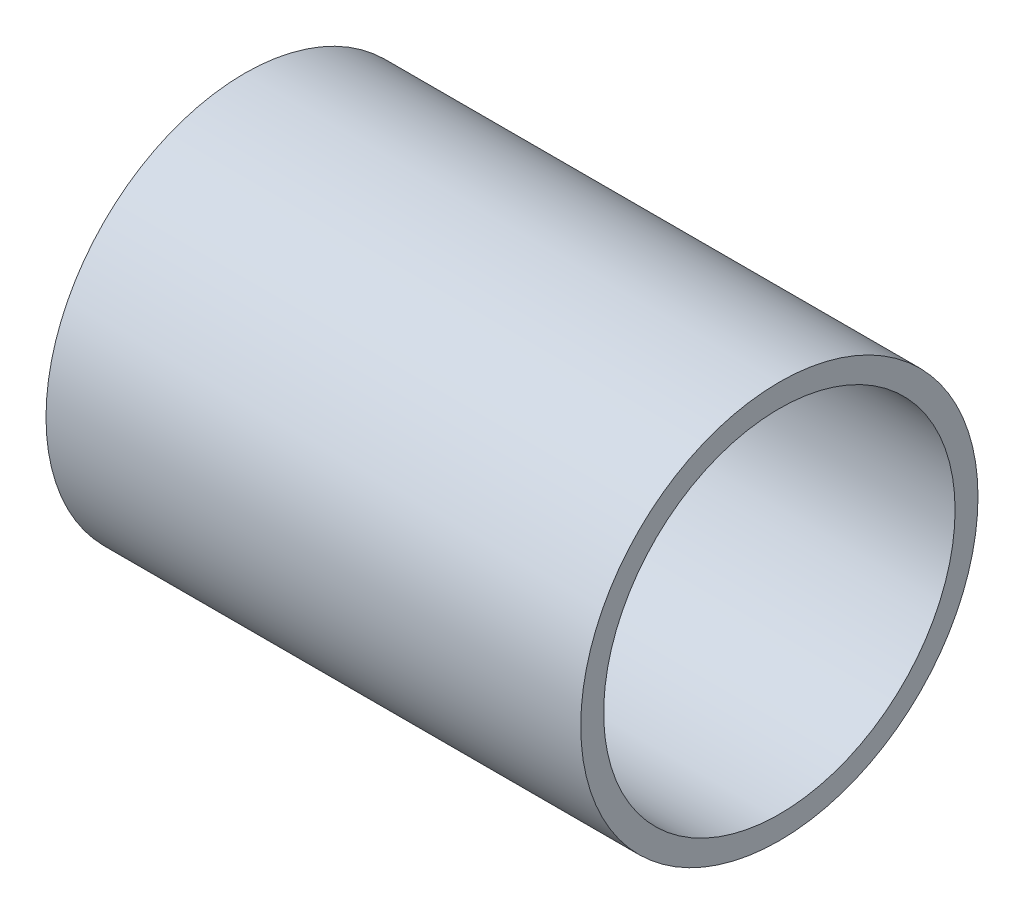
ISO-10303-21;
HEADER;
FILE_DESCRIPTION(('STEP AP214'),'2;1');
FILE_NAME('part.step','',(''),(''),'','','');
FILE_SCHEMA(('AUTOMOTIVE_DESIGN { 1 0 10303 214 1 1 1 1 }'));
ENDSEC;
DATA;
#1=APPLICATION_CONTEXT('core data for automotive mechanical design processes');
#2=APPLICATION_PROTOCOL_DEFINITION('international standard','automotive_design',2000,#1);
#3=PRODUCT_CONTEXT('',#1,'mechanical');
#4=PRODUCT('Part','Part','',(#3));
#5=PRODUCT_RELATED_PRODUCT_CATEGORY('part','',(#4));
#6=PRODUCT_DEFINITION_FORMATION('','',#4);
#7=PRODUCT_DEFINITION_CONTEXT('part definition',#1,'design');
#8=PRODUCT_DEFINITION('design','',#6,#7);
#9=PRODUCT_DEFINITION_SHAPE('','',#8);
#10=(LENGTH_UNIT() NAMED_UNIT(*) SI_UNIT(.MILLI.,.METRE.));
#11=(NAMED_UNIT(*) PLANE_ANGLE_UNIT() SI_UNIT($,.RADIAN.));
#12=(NAMED_UNIT(*) SI_UNIT($,.STERADIAN.) SOLID_ANGLE_UNIT());
#13=UNCERTAINTY_MEASURE_WITH_UNIT(LENGTH_MEASURE(1.E-05),#10,'distance_accuracy_value','');
#14=(GEOMETRIC_REPRESENTATION_CONTEXT(3) GLOBAL_UNCERTAINTY_ASSIGNED_CONTEXT((#13)) GLOBAL_UNIT_ASSIGNED_CONTEXT((#10,
#11,#12)) REPRESENTATION_CONTEXT('',''));
#15=CARTESIAN_POINT('',(0.,0.,0.));
#16=DIRECTION('',(0.,0.,1.));
#17=DIRECTION('',(1.,0.,0.));
#18=AXIS2_PLACEMENT_3D('',#15,#16,#17);
#19=CARTESIAN_POINT('',(-70.,0.,0.));
#20=DIRECTION('',(1.,0.,0.));
#21=DIRECTION('',(0.,0.,-1.));
#22=AXIS2_PLACEMENT_3D('',#19,#20,#21);
#23=CYLINDRICAL_SURFACE('',#22,26.);
#24=CARTESIAN_POINT('',(-70.,0.,0.));
#25=DIRECTION('',(1.,0.,0.));
#26=DIRECTION('',(0.,0.,-1.));
#27=AXIS2_PLACEMENT_3D('',#24,#25,#26);
#28=CIRCLE('',#27,26.);
#29=CARTESIAN_POINT('',(-70.,0.,-26.));
#30=VERTEX_POINT('',#29);
#31=EDGE_CURVE('E10',#30,#30,#28,.T.);
#32=ORIENTED_EDGE('',*,*,#31,.T.);
#33=EDGE_LOOP('',(#32));
#34=FACE_BOUND('',#33,.T.);
#35=CARTESIAN_POINT('',(0.,0.,0.));
#36=DIRECTION('',(1.,0.,0.));
#37=DIRECTION('',(0.,0.,-1.));
#38=AXIS2_PLACEMENT_3D('',#35,#36,#37);
#39=CIRCLE('',#38,26.);
#40=CARTESIAN_POINT('',(0.,0.,-26.));
#41=VERTEX_POINT('',#40);
#42=EDGE_CURVE('E40',#41,#41,#39,.T.);
#43=ORIENTED_EDGE('',*,*,#42,.F.);
#44=EDGE_LOOP('',(#43));
#45=FACE_BOUND('',#44,.T.);
#46=ADVANCED_FACE('F37',(#34,#45),#23,.T.);
#47=CARTESIAN_POINT('',(-70.,0.,0.));
#48=DIRECTION('',(1.,0.,0.));
#49=DIRECTION('',(0.,0.,-1.));
#50=AXIS2_PLACEMENT_3D('',#47,#48,#49);
#51=PLANE('',#50);
#52=CARTESIAN_POINT('',(-70.,0.,0.));
#53=DIRECTION('',(1.,0.,0.));
#54=DIRECTION('',(0.,0.,-1.));
#55=AXIS2_PLACEMENT_3D('',#52,#53,#54);
#56=CIRCLE('',#55,23.);
#57=CARTESIAN_POINT('',(-70.,0.,-23.));
#58=VERTEX_POINT('',#57);
#59=EDGE_CURVE('E49',#58,#58,#56,.T.);
#60=ORIENTED_EDGE('',*,*,#59,.T.);
#61=EDGE_LOOP('',(#60));
#62=FACE_BOUND('',#61,.T.);
#63=ORIENTED_EDGE('',*,*,#31,.F.);
#64=EDGE_LOOP('',(#63));
#65=FACE_BOUND('',#64,.T.);
#66=ADVANCED_FACE('F59',(#62,#65),#51,.F.);
#67=CARTESIAN_POINT('',(0.,0.,0.));
#68=DIRECTION('',(1.,0.,0.));
#69=DIRECTION('',(0.,0.,-1.));
#70=AXIS2_PLACEMENT_3D('',#67,#68,#69);
#71=PLANE('',#70);
#72=CARTESIAN_POINT('',(0.,0.,0.));
#73=DIRECTION('',(1.,0.,0.));
#74=DIRECTION('',(0.,0.,-1.));
#75=AXIS2_PLACEMENT_3D('',#72,#73,#74);
#76=CIRCLE('',#75,23.);
#77=CARTESIAN_POINT('',(0.,0.,-23.));
#78=VERTEX_POINT('',#77);
#79=EDGE_CURVE('E51',#78,#78,#76,.T.);
#80=ORIENTED_EDGE('',*,*,#79,.F.);
#81=EDGE_LOOP('',(#80));
#82=FACE_BOUND('',#81,.T.);
#83=ORIENTED_EDGE('',*,*,#42,.T.);
#84=EDGE_LOOP('',(#83));
#85=FACE_BOUND('',#84,.T.);
#86=ADVANCED_FACE('F65',(#82,#85),#71,.T.);
#87=CARTESIAN_POINT('',(-70.,0.,0.));
#88=DIRECTION('',(1.,0.,0.));
#89=DIRECTION('',(0.,0.,-1.));
#90=AXIS2_PLACEMENT_3D('',#87,#88,#89);
#91=CYLINDRICAL_SURFACE('',#90,23.);
#92=ORIENTED_EDGE('',*,*,#59,.F.);
#93=EDGE_LOOP('',(#92));
#94=FACE_BOUND('',#93,.T.);
#95=ORIENTED_EDGE('',*,*,#79,.T.);
#96=EDGE_LOOP('',(#95));
#97=FACE_BOUND('',#96,.T.);
#98=ADVANCED_FACE('F62',(#94,#97),#91,.F.);
#99=CLOSED_SHELL('',(#46,#66,#86,#98));
#100=MANIFOLD_SOLID_BREP('B2',#99);
#101=ADVANCED_BREP_SHAPE_REPRESENTATION('',(#18,#100),#14);
#102=SHAPE_DEFINITION_REPRESENTATION(#9,#101);
ENDSEC;
END-ISO-10303-21;
